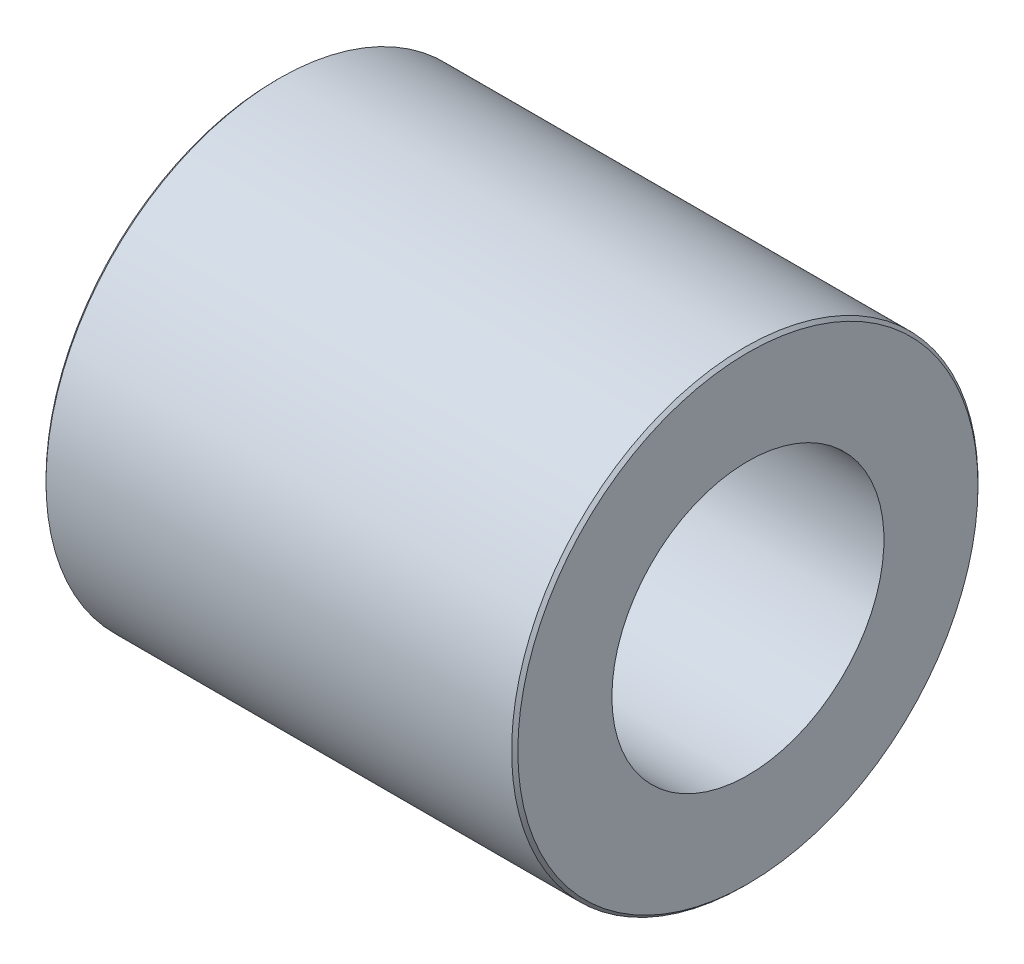
ISO-10303-21;
HEADER;
FILE_DESCRIPTION(('STEP AP214'),'2;1');
FILE_NAME('part.step','',(''),(''),'','','');
FILE_SCHEMA(('AUTOMOTIVE_DESIGN { 1 0 10303 214 1 1 1 1 }'));
ENDSEC;
DATA;
#1=APPLICATION_CONTEXT('core data for automotive mechanical design processes');
#2=APPLICATION_PROTOCOL_DEFINITION('international standard','automotive_design',2000,#1);
#3=PRODUCT_CONTEXT('',#1,'mechanical');
#4=PRODUCT('Part','Part','',(#3));
#5=PRODUCT_RELATED_PRODUCT_CATEGORY('part','',(#4));
#6=PRODUCT_DEFINITION_FORMATION('','',#4);
#7=PRODUCT_DEFINITION_CONTEXT('part definition',#1,'design');
#8=PRODUCT_DEFINITION('design','',#6,#7);
#9=PRODUCT_DEFINITION_SHAPE('','',#8);
#10=(LENGTH_UNIT() NAMED_UNIT(*) SI_UNIT(.MILLI.,.METRE.));
#11=(NAMED_UNIT(*) PLANE_ANGLE_UNIT() SI_UNIT($,.RADIAN.));
#12=(NAMED_UNIT(*) SI_UNIT($,.STERADIAN.) SOLID_ANGLE_UNIT());
#13=UNCERTAINTY_MEASURE_WITH_UNIT(LENGTH_MEASURE(1.E-05),#10,'distance_accuracy_value','');
#14=(GEOMETRIC_REPRESENTATION_CONTEXT(3) GLOBAL_UNCERTAINTY_ASSIGNED_CONTEXT((#13)) GLOBAL_UNIT_ASSIGNED_CONTEXT((#10,
#11,#12)) REPRESENTATION_CONTEXT('',''));
#15=CARTESIAN_POINT('',(0.,0.,0.));
#16=DIRECTION('',(0.,0.,1.));
#17=DIRECTION('',(1.,0.,0.));
#18=AXIS2_PLACEMENT_3D('',#15,#16,#17);
#19=CARTESIAN_POINT('',(-72.263,0.,0.));
#20=DIRECTION('',(-1.,0.,0.));
#21=DIRECTION('',(0.,-1.,0.));
#22=AXIS2_PLACEMENT_3D('',#19,#20,#21);
#23=PLANE('',#22);
#24=CARTESIAN_POINT('',(-72.263,0.,0.));
#25=DIRECTION('',(-1.,0.,0.));
#26=DIRECTION('',(0.,0.,1.));
#27=AXIS2_PLACEMENT_3D('',#24,#25,#26);
#28=CIRCLE('',#27,22.225);
#29=CARTESIAN_POINT('',(-72.263,0.,22.225));
#30=VERTEX_POINT('',#29);
#31=EDGE_CURVE('E47',#30,#30,#28,.F.);
#32=ORIENTED_EDGE('',*,*,#31,.T.);
#33=EDGE_LOOP('',(#32));
#34=FACE_BOUND('',#33,.T.);
#35=CARTESIAN_POINT('',(-72.263,0.,0.));
#36=DIRECTION('',(1.,0.,0.));
#37=DIRECTION('',(0.,1.,0.));
#38=AXIS2_PLACEMENT_3D('',#35,#36,#37);
#39=CIRCLE('',#38,33.274);
#40=CARTESIAN_POINT('',(-72.263,33.274,0.));
#41=VERTEX_POINT('',#40);
#42=EDGE_CURVE('E18',#41,#41,#39,.F.);
#43=ORIENTED_EDGE('',*,*,#42,.T.);
#44=EDGE_LOOP('',(#43));
#45=FACE_BOUND('',#44,.T.);
#46=ADVANCED_FACE('F15',(#34,#45),#23,.T.);
#47=CARTESIAN_POINT('',(0.,0.,0.));
#48=DIRECTION('',(1.,0.,0.));
#49=DIRECTION('',(0.,1.,0.));
#50=AXIS2_PLACEMENT_3D('',#47,#48,#49);
#51=CYLINDRICAL_SURFACE('',#50,33.274);
#52=CARTESIAN_POINT('',(-77.0889999999999,0.,0.));
#53=DIRECTION('',(1.,0.,0.));
#54=DIRECTION('',(0.,1.,0.));
#55=AXIS2_PLACEMENT_3D('',#52,#53,#54);
#56=CIRCLE('',#55,33.274);
#57=CARTESIAN_POINT('',(-77.0889999999999,33.274,0.));
#58=VERTEX_POINT('',#57);
#59=EDGE_CURVE('E44',#58,#58,#56,.T.);
#60=ORIENTED_EDGE('',*,*,#59,.F.);
#61=EDGE_LOOP('',(#60));
#62=FACE_BOUND('',#61,.T.);
#63=ORIENTED_EDGE('',*,*,#42,.F.);
#64=EDGE_LOOP('',(#63));
#65=FACE_BOUND('',#64,.T.);
#66=ADVANCED_FACE('F57',(#62,#65),#51,.F.);
#67=CARTESIAN_POINT('',(0.,0.,0.));
#68=DIRECTION('',(-1.,0.,0.));
#69=DIRECTION('',(0.,0.,1.));
#70=AXIS2_PLACEMENT_3D('',#67,#68,#69);
#71=CYLINDRICAL_SURFACE('',#70,22.225);
#72=ORIENTED_EDGE('',*,*,#31,.F.);
#73=EDGE_LOOP('',(#72));
#74=FACE_BOUND('',#73,.T.);
#75=CARTESIAN_POINT('',(0.,0.,0.));
#76=DIRECTION('',(-1.,0.,0.));
#77=DIRECTION('',(0.,0.,1.));
#78=AXIS2_PLACEMENT_3D('',#75,#76,#77);
#79=CIRCLE('',#78,22.225);
#80=CARTESIAN_POINT('',(0.,0.,22.225));
#81=VERTEX_POINT('',#80);
#82=EDGE_CURVE('E40',#81,#81,#79,.T.);
#83=ORIENTED_EDGE('',*,*,#82,.F.);
#84=EDGE_LOOP('',(#83));
#85=FACE_BOUND('',#84,.T.);
#86=ADVANCED_FACE('F59',(#74,#85),#71,.F.);
#87=CARTESIAN_POINT('',(-77.089,33.274,0.));
#88=DIRECTION('',(-1.,0.,0.));
#89=DIRECTION('',(0.,-1.,0.));
#90=AXIS2_PLACEMENT_3D('',#87,#88,#89);
#91=PLANE('',#90);
#92=ORIENTED_EDGE('',*,*,#59,.T.);
#93=EDGE_LOOP('',(#92));
#94=FACE_BOUND('',#93,.T.);
#95=CARTESIAN_POINT('',(-77.089,0.,0.));
#96=DIRECTION('',(1.,0.,0.));
#97=DIRECTION('',(0.,1.,0.));
#98=AXIS2_PLACEMENT_3D('',#95,#96,#97);
#99=CIRCLE('',#98,37.592);
#100=CARTESIAN_POINT('',(-77.089,37.592,0.));
#101=VERTEX_POINT('',#100);
#102=EDGE_CURVE('E37',#101,#101,#99,.T.);
#103=ORIENTED_EDGE('',*,*,#102,.F.);
#104=EDGE_LOOP('',(#103));
#105=FACE_BOUND('',#104,.T.);
#106=ADVANCED_FACE('F65',(#94,#105),#91,.T.);
#107=CARTESIAN_POINT('',(0.,0.,0.));
#108=DIRECTION('',(1.,0.,0.));
#109=DIRECTION('',(0.,1.,0.));
#110=AXIS2_PLACEMENT_3D('',#107,#108,#109);
#111=PLANE('',#110);
#112=ORIENTED_EDGE('',*,*,#82,.T.);
#113=EDGE_LOOP('',(#112));
#114=FACE_BOUND('',#113,.T.);
#115=CARTESIAN_POINT('',(0.,0.,0.));
#116=DIRECTION('',(-1.,0.,0.));
#117=DIRECTION('',(0.,-1.,0.));
#118=AXIS2_PLACEMENT_3D('',#115,#116,#117);
#119=CIRCLE('',#118,37.592);
#120=CARTESIAN_POINT('',(0.,-37.592,0.));
#121=VERTEX_POINT('',#120);
#122=EDGE_CURVE('E31',#121,#121,#119,.T.);
#123=ORIENTED_EDGE('',*,*,#122,.F.);
#124=EDGE_LOOP('',(#123));
#125=FACE_BOUND('',#124,.T.);
#126=ADVANCED_FACE('F82',(#114,#125),#111,.T.);
#127=CARTESIAN_POINT('',(-76.581,0.,0.));
#128=DIRECTION('',(1.,0.,0.));
#129=DIRECTION('',(0.,1.,0.));
#130=AXIS2_PLACEMENT_3D('',#127,#128,#129);
#131=CONICAL_SURFACE('',#130,38.1,0.785398163397448);
#132=ORIENTED_EDGE('',*,*,#102,.T.);
#133=EDGE_LOOP('',(#132));
#134=FACE_BOUND('',#133,.T.);
#135=CARTESIAN_POINT('',(-76.581,0.,0.));
#136=DIRECTION('',(1.,0.,0.));
#137=DIRECTION('',(0.,1.,0.));
#138=AXIS2_PLACEMENT_3D('',#135,#136,#137);
#139=CIRCLE('',#138,38.1);
#140=CARTESIAN_POINT('',(-76.581,38.1,0.));
#141=VERTEX_POINT('',#140);
#142=EDGE_CURVE('E23',#141,#141,#139,.T.);
#143=ORIENTED_EDGE('',*,*,#142,.F.);
#144=EDGE_LOOP('',(#143));
#145=FACE_BOUND('',#144,.T.);
#146=ADVANCED_FACE('F75',(#134,#145),#131,.T.);
#147=CARTESIAN_POINT('',(-0.508000000000024,0.,0.));
#148=DIRECTION('',(-1.,0.,0.));
#149=DIRECTION('',(0.,-1.,0.));
#150=AXIS2_PLACEMENT_3D('',#147,#148,#149);
#151=CONICAL_SURFACE('',#150,38.1,0.785398163397429);
#152=ORIENTED_EDGE('',*,*,#122,.T.);
#153=EDGE_LOOP('',(#152));
#154=FACE_BOUND('',#153,.T.);
#155=CARTESIAN_POINT('',(-0.507999999999992,0.,0.));
#156=DIRECTION('',(1.,0.,0.));
#157=DIRECTION('',(0.,1.,0.));
#158=AXIS2_PLACEMENT_3D('',#155,#156,#157);
#159=CIRCLE('',#158,38.1);
#160=CARTESIAN_POINT('',(-0.507999999999996,38.1,0.));
#161=VERTEX_POINT('',#160);
#162=EDGE_CURVE('E10',#161,#161,#159,.F.);
#163=ORIENTED_EDGE('',*,*,#162,.F.);
#164=EDGE_LOOP('',(#163));
#165=FACE_BOUND('',#164,.T.);
#166=ADVANCED_FACE('F71',(#154,#165),#151,.T.);
#167=CARTESIAN_POINT('',(0.,0.,0.));
#168=DIRECTION('',(1.,0.,0.));
#169=DIRECTION('',(0.,1.,0.));
#170=AXIS2_PLACEMENT_3D('',#167,#168,#169);
#171=CYLINDRICAL_SURFACE('',#170,38.1);
#172=ORIENTED_EDGE('',*,*,#162,.T.);
#173=EDGE_LOOP('',(#172));
#174=FACE_BOUND('',#173,.T.);
#175=ORIENTED_EDGE('',*,*,#142,.T.);
#176=EDGE_LOOP('',(#175));
#177=FACE_BOUND('',#176,.T.);
#178=ADVANCED_FACE('F69',(#174,#177),#171,.T.);
#179=CLOSED_SHELL('',(#46,#66,#86,#106,#126,#146,#166,#178));
#180=MANIFOLD_SOLID_BREP('B1',#179);
#181=ADVANCED_BREP_SHAPE_REPRESENTATION('',(#18,#180),#14);
#182=SHAPE_DEFINITION_REPRESENTATION(#9,#181);
ENDSEC;
END-ISO-10303-21;
